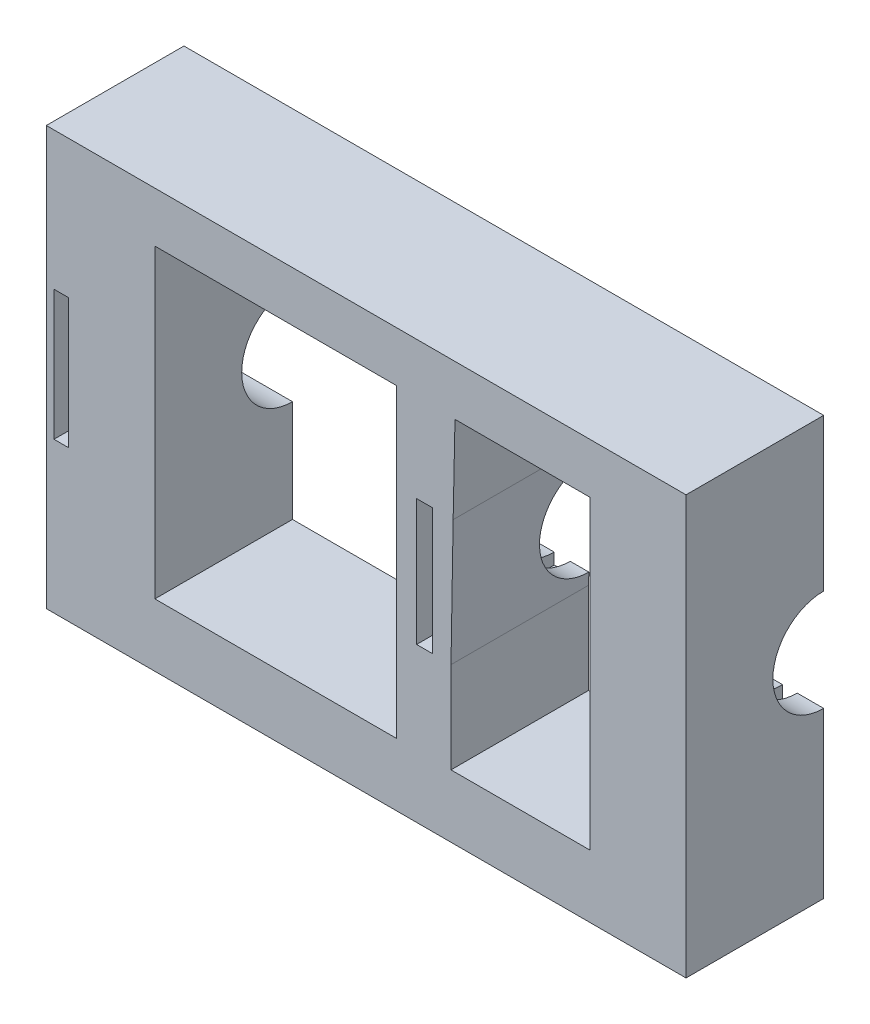
ISO-10303-21;
HEADER;
FILE_DESCRIPTION(('STEP AP214'),'2;1');
FILE_NAME('part.step','',(''),(''),'','','');
FILE_SCHEMA(('AUTOMOTIVE_DESIGN { 1 0 10303 214 1 1 1 1 }'));
ENDSEC;
DATA;
#1=APPLICATION_CONTEXT('core data for automotive mechanical design processes');
#2=APPLICATION_PROTOCOL_DEFINITION('international standard','automotive_design',2000,#1);
#3=PRODUCT_CONTEXT('',#1,'mechanical');
#4=PRODUCT('Part','Part','',(#3));
#5=PRODUCT_RELATED_PRODUCT_CATEGORY('part','',(#4));
#6=PRODUCT_DEFINITION_FORMATION('','',#4);
#7=PRODUCT_DEFINITION_CONTEXT('part definition',#1,'design');
#8=PRODUCT_DEFINITION('design','',#6,#7);
#9=PRODUCT_DEFINITION_SHAPE('','',#8);
#10=(LENGTH_UNIT() NAMED_UNIT(*) SI_UNIT(.MILLI.,.METRE.));
#11=(NAMED_UNIT(*) PLANE_ANGLE_UNIT() SI_UNIT($,.RADIAN.));
#12=(NAMED_UNIT(*) SI_UNIT($,.STERADIAN.) SOLID_ANGLE_UNIT());
#13=UNCERTAINTY_MEASURE_WITH_UNIT(LENGTH_MEASURE(1.E-05),#10,'distance_accuracy_value','');
#14=(GEOMETRIC_REPRESENTATION_CONTEXT(3) GLOBAL_UNCERTAINTY_ASSIGNED_CONTEXT((#13)) GLOBAL_UNIT_ASSIGNED_CONTEXT((#10,
#11,#12)) REPRESENTATION_CONTEXT('',''));
#15=CARTESIAN_POINT('',(0.,0.,0.));
#16=DIRECTION('',(0.,0.,1.));
#17=DIRECTION('',(1.,0.,0.));
#18=AXIS2_PLACEMENT_3D('',#15,#16,#17);
#19=CARTESIAN_POINT('',(0.,22.0472,0.));
#20=DIRECTION('',(0.,1.,0.));
#21=DIRECTION('',(0.,0.,1.));
#22=AXIS2_PLACEMENT_3D('',#19,#20,#21);
#23=PLANE('',#22);
#24=DIRECTION('',(1.,0.,0.));
#25=VECTOR('',#24,1.);
#26=CARTESIAN_POINT('',(0.,22.0472,-3.17171216904465));
#27=LINE('',#26,#25);
#28=CARTESIAN_POINT('',(10.9894216317088,22.0472,-3.17171216904465));
#29=VERTEX_POINT('',#28);
#30=CARTESIAN_POINT('',(35.4588719569476,22.0472,-3.17171216904465));
#31=VERTEX_POINT('',#30);
#32=EDGE_CURVE('E45',#29,#31,#27,.T.);
#33=ORIENTED_EDGE('',*,*,#32,.F.);
#34=DIRECTION('',(0.,0.,-1.));
#35=VECTOR('',#34,1.);
#36=CARTESIAN_POINT('',(10.9894216317088,22.0472,0.));
#37=LINE('',#36,#35);
#38=CARTESIAN_POINT('',(10.9894216317088,22.0472,-17.1069));
#39=VERTEX_POINT('',#38);
#40=EDGE_CURVE('E389',#29,#39,#37,.T.);
#41=ORIENTED_EDGE('',*,*,#40,.T.);
#42=DIRECTION('',(-1.,0.,0.));
#43=VECTOR('',#42,1.);
#44=CARTESIAN_POINT('',(66.04,22.0472,-17.1069));
#45=LINE('',#44,#43);
#46=CARTESIAN_POINT('',(35.4588719569476,22.0472,-17.1069));
#47=VERTEX_POINT('',#46);
#48=EDGE_CURVE('E357',#47,#39,#45,.T.);
#49=ORIENTED_EDGE('',*,*,#48,.F.);
#50=DIRECTION('',(0.,0.,-1.));
#51=VECTOR('',#50,1.);
#52=CARTESIAN_POINT('',(35.4588719569476,22.0472,1.9431));
#53=LINE('',#52,#51);
#54=EDGE_CURVE('E306',#31,#47,#53,.T.);
#55=ORIENTED_EDGE('',*,*,#54,.F.);
#56=EDGE_LOOP('',(#33,#41,#49,#55));
#57=FACE_BOUND('',#56,.T.);
#58=ADVANCED_FACE('F35',(#57),#23,.F.);
#59=CARTESIAN_POINT('',(0.,-8.89,0.));
#60=DIRECTION('',(0.,-1.,0.));
#61=DIRECTION('',(0.,0.,-1.));
#62=AXIS2_PLACEMENT_3D('',#59,#60,#61);
#63=PLANE('',#62);
#64=DIRECTION('',(-1.,0.,0.));
#65=VECTOR('',#64,1.);
#66=CARTESIAN_POINT('',(0.,-8.89,-3.17171216904465));
#67=LINE('',#66,#65);
#68=CARTESIAN_POINT('',(35.4588719569476,-8.89,-3.17171216904465));
#69=VERTEX_POINT('',#68);
#70=CARTESIAN_POINT('',(10.9894216317088,-8.89,-3.17171216904465));
#71=VERTEX_POINT('',#70);
#72=EDGE_CURVE('E11',#69,#71,#67,.T.);
#73=ORIENTED_EDGE('',*,*,#72,.F.);
#74=DIRECTION('',(0.,0.,-1.));
#75=VECTOR('',#74,1.);
#76=CARTESIAN_POINT('',(35.4588719569476,-8.89,0.));
#77=LINE('',#76,#75);
#78=CARTESIAN_POINT('',(35.4588719569476,-8.89,-17.1069));
#79=VERTEX_POINT('',#78);
#80=EDGE_CURVE('E321',#69,#79,#77,.T.);
#81=ORIENTED_EDGE('',*,*,#80,.T.);
#82=DIRECTION('',(1.,0.,0.));
#83=VECTOR('',#82,1.);
#84=CARTESIAN_POINT('',(66.04,-8.89,-17.1069));
#85=LINE('',#84,#83);
#86=CARTESIAN_POINT('',(10.9894216317088,-8.89,-17.1069));
#87=VERTEX_POINT('',#86);
#88=EDGE_CURVE('E417',#87,#79,#85,.T.);
#89=ORIENTED_EDGE('',*,*,#88,.F.);
#90=DIRECTION('',(0.,0.,1.));
#91=VECTOR('',#90,1.);
#92=CARTESIAN_POINT('',(10.9894216317088,-8.89,0.));
#93=LINE('',#92,#91);
#94=EDGE_CURVE('E353',#87,#71,#93,.T.);
#95=ORIENTED_EDGE('',*,*,#94,.T.);
#96=EDGE_LOOP('',(#73,#81,#89,#95));
#97=FACE_BOUND('',#96,.T.);
#98=ADVANCED_FACE('F696',(#97),#63,.F.);
#99=CARTESIAN_POINT('',(55.0505783682912,13.1572,-3.21005743926288));
#100=DIRECTION('',(1.,0.,0.));
#101=DIRECTION('',(0.,0.,-1.));
#102=AXIS2_PLACEMENT_3D('',#99,#100,#101);
#103=PLANE('',#102);
#104=DIRECTION('',(0.,-1.,0.));
#105=VECTOR('',#104,1.);
#106=CARTESIAN_POINT('',(55.0505783682912,13.1572,-3.17171216904465));
#107=LINE('',#106,#105);
#108=CARTESIAN_POINT('',(55.0505783682912,22.0472,-3.17171216904465));
#109=VERTEX_POINT('',#108);
#110=CARTESIAN_POINT('',(55.0505783682912,-8.89,-3.17171216904465));
#111=VERTEX_POINT('',#110);
#112=EDGE_CURVE('E292',#109,#111,#107,.T.);
#113=ORIENTED_EDGE('',*,*,#112,.F.);
#114=DIRECTION('',(0.,0.,1.));
#115=VECTOR('',#114,1.);
#116=CARTESIAN_POINT('',(55.0505783682912,22.0472,-17.1069));
#117=LINE('',#116,#115);
#118=CARTESIAN_POINT('',(55.0505783682912,22.0472,-17.1069));
#119=VERTEX_POINT('',#118);
#120=EDGE_CURVE('E384',#119,#109,#117,.T.);
#121=ORIENTED_EDGE('',*,*,#120,.F.);
#122=DIRECTION('',(0.,-1.,0.));
#123=VECTOR('',#122,1.);
#124=CARTESIAN_POINT('',(55.0505783682912,13.1572,-17.1069));
#125=LINE('',#124,#123);
#126=CARTESIAN_POINT('',(55.0505783682912,11.7221,-17.1069));
#127=VERTEX_POINT('',#126);
#128=EDGE_CURVE('E349',#119,#127,#125,.T.);
#129=ORIENTED_EDGE('',*,*,#128,.T.);
#130=CARTESIAN_POINT('',(55.0505783682912,6.5786,-17.1069));
#131=DIRECTION('',(1.,0.,0.));
#132=DIRECTION('',(0.,0.,-1.));
#133=AXIS2_PLACEMENT_3D('',#130,#131,#132);
#134=CIRCLE('',#133,5.1435);
#135=CARTESIAN_POINT('',(55.0505783682912,1.4351,-17.1069));
#136=VERTEX_POINT('',#135);
#137=EDGE_CURVE('E352',#127,#136,#134,.T.);
#138=ORIENTED_EDGE('',*,*,#137,.T.);
#139=CARTESIAN_POINT('',(55.0505783682912,-8.89,-17.1069));
#140=VERTEX_POINT('',#139);
#141=EDGE_CURVE('E354',#136,#140,#125,.T.);
#142=ORIENTED_EDGE('',*,*,#141,.T.);
#143=DIRECTION('',(0.,0.,-1.));
#144=VECTOR('',#143,1.);
#145=CARTESIAN_POINT('',(55.0505783682912,-8.89,-17.1069));
#146=LINE('',#145,#144);
#147=EDGE_CURVE('E312',#111,#140,#146,.T.);
#148=ORIENTED_EDGE('',*,*,#147,.F.);
#149=EDGE_LOOP('',(#113,#121,#129,#138,#142,#148));
#150=FACE_BOUND('',#149,.T.);
#151=ADVANCED_FACE('F607',(#150),#103,.F.);
#152=CARTESIAN_POINT('',(10.9894216317088,13.1572,-17.1069));
#153=DIRECTION('',(-1.,0.,0.));
#154=DIRECTION('',(0.,0.,1.));
#155=AXIS2_PLACEMENT_3D('',#152,#153,#154);
#156=PLANE('',#155);
#157=DIRECTION('',(0.,1.,0.));
#158=VECTOR('',#157,1.);
#159=CARTESIAN_POINT('',(10.9894216317088,13.1572,-3.17171216904465));
#160=LINE('',#159,#158);
#161=EDGE_CURVE('E518',#71,#29,#160,.T.);
#162=ORIENTED_EDGE('',*,*,#161,.F.);
#163=ORIENTED_EDGE('',*,*,#94,.F.);
#164=DIRECTION('',(0.,-1.,0.));
#165=VECTOR('',#164,1.);
#166=CARTESIAN_POINT('',(10.9894216317088,13.1572,-17.1069));
#167=LINE('',#166,#165);
#168=CARTESIAN_POINT('',(10.9894216317088,1.4351,-17.1069));
#169=VERTEX_POINT('',#168);
#170=EDGE_CURVE('E358',#169,#87,#167,.T.);
#171=ORIENTED_EDGE('',*,*,#170,.F.);
#172=CARTESIAN_POINT('',(10.9894216317088,6.5786,-17.1069));
#173=DIRECTION('',(-1.,0.,0.));
#174=DIRECTION('',(0.,0.,1.));
#175=AXIS2_PLACEMENT_3D('',#172,#173,#174);
#176=CIRCLE('',#175,5.1435);
#177=CARTESIAN_POINT('',(10.9894216317088,11.7221,-17.1069));
#178=VERTEX_POINT('',#177);
#179=EDGE_CURVE('E361',#169,#178,#176,.T.);
#180=ORIENTED_EDGE('',*,*,#179,.T.);
#181=EDGE_CURVE('E332',#39,#178,#167,.T.);
#182=ORIENTED_EDGE('',*,*,#181,.F.);
#183=ORIENTED_EDGE('',*,*,#40,.F.);
#184=EDGE_LOOP('',(#162,#163,#171,#180,#182,#183));
#185=FACE_BOUND('',#184,.T.);
#186=ADVANCED_FACE('F655',(#185),#156,.F.);
#187=CARTESIAN_POINT('',(0.,13.1572,-17.1069));
#188=DIRECTION('',(1.,0.,0.));
#189=DIRECTION('',(0.,0.,-1.));
#190=AXIS2_PLACEMENT_3D('',#187,#188,#189);
#191=PLANE('',#190);
#192=DIRECTION('',(0.,-1.,0.));
#193=VECTOR('',#192,1.);
#194=CARTESIAN_POINT('',(0.,27.1272,-3.17171216904465));
#195=LINE('',#194,#193);
#196=CARTESIAN_POINT('',(0.,27.1272,-3.17171216904465));
#197=VERTEX_POINT('',#196);
#198=CARTESIAN_POINT('',(0.,-15.24,-3.17171216904465));
#199=VERTEX_POINT('',#198);
#200=EDGE_CURVE('E39',#197,#199,#195,.T.);
#201=ORIENTED_EDGE('',*,*,#200,.F.);
#202=DIRECTION('',(0.,0.,1.));
#203=VECTOR('',#202,1.);
#204=CARTESIAN_POINT('',(0.,27.1272,-17.1069));
#205=LINE('',#204,#203);
#206=CARTESIAN_POINT('',(0.,27.1272,-17.1069));
#207=VERTEX_POINT('',#206);
#208=EDGE_CURVE('E387',#207,#197,#205,.T.);
#209=ORIENTED_EDGE('',*,*,#208,.F.);
#210=DIRECTION('',(0.,-1.,0.));
#211=VECTOR('',#210,1.);
#212=CARTESIAN_POINT('',(0.,13.1572,-17.1069));
#213=LINE('',#212,#211);
#214=CARTESIAN_POINT('',(0.,11.7221,-17.1069));
#215=VERTEX_POINT('',#214);
#216=EDGE_CURVE('E327',#207,#215,#213,.T.);
#217=ORIENTED_EDGE('',*,*,#216,.T.);
#218=CARTESIAN_POINT('',(0.,6.5786,-17.1069));
#219=DIRECTION('',(1.,0.,0.));
#220=DIRECTION('',(0.,0.,-1.));
#221=AXIS2_PLACEMENT_3D('',#218,#219,#220);
#222=CIRCLE('',#221,5.1435);
#223=CARTESIAN_POINT('',(0.,1.4351,-17.1069));
#224=VERTEX_POINT('',#223);
#225=EDGE_CURVE('E323',#215,#224,#222,.T.);
#226=ORIENTED_EDGE('',*,*,#225,.T.);
#227=CARTESIAN_POINT('',(0.,-15.24,-17.1069));
#228=VERTEX_POINT('',#227);
#229=EDGE_CURVE('E326',#224,#228,#213,.T.);
#230=ORIENTED_EDGE('',*,*,#229,.T.);
#231=DIRECTION('',(0.,0.,-1.));
#232=VECTOR('',#231,1.);
#233=CARTESIAN_POINT('',(0.,-15.24,3.17828783095535));
#234=LINE('',#233,#232);
#235=EDGE_CURVE('E505',#199,#228,#234,.T.);
#236=ORIENTED_EDGE('',*,*,#235,.F.);
#237=EDGE_LOOP('',(#201,#209,#217,#226,#230,#236));
#238=FACE_BOUND('',#237,.T.);
#239=ADVANCED_FACE('F545',(#238),#191,.F.);
#240=DIRECTION('',(1.,0.,0.));
#241=VECTOR('',#240,1.);
#242=CARTESIAN_POINT('',(0.,22.0472,-3.17171216904465));
#243=LINE('',#242,#241);
#244=CARTESIAN_POINT('',(41.3758963344435,22.0472,-3.17171216904465));
#245=VERTEX_POINT('',#244);
#246=EDGE_CURVE('E477',#245,#109,#243,.T.);
#247=ORIENTED_EDGE('',*,*,#246,.F.);
#248=DIRECTION('',(0.,0.,-1.));
#249=VECTOR('',#248,1.);
#250=CARTESIAN_POINT('',(41.3758963344435,22.0472,0.));
#251=LINE('',#250,#249);
#252=CARTESIAN_POINT('',(41.3758963344435,22.0472,-17.1069));
#253=VERTEX_POINT('',#252);
#254=EDGE_CURVE('E388',#245,#253,#251,.T.);
#255=ORIENTED_EDGE('',*,*,#254,.T.);
#256=EDGE_CURVE('E391',#119,#253,#45,.T.);
#257=ORIENTED_EDGE('',*,*,#256,.F.);
#258=ORIENTED_EDGE('',*,*,#120,.T.);
#259=EDGE_LOOP('',(#247,#255,#257,#258));
#260=FACE_BOUND('',#259,.T.);
#261=ADVANCED_FACE('F610',(#260),#23,.F.);
#262=CARTESIAN_POINT('',(0.,27.1272,0.));
#263=DIRECTION('',(0.,1.,0.));
#264=DIRECTION('',(0.,0.,1.));
#265=AXIS2_PLACEMENT_3D('',#262,#263,#264);
#266=PLANE('',#265);
#267=ORIENTED_EDGE('',*,*,#208,.T.);
#268=DIRECTION('',(-1.,0.,0.));
#269=VECTOR('',#268,1.);
#270=CARTESIAN_POINT('',(0.,27.1272,-3.17171216904465));
#271=LINE('',#270,#269);
#272=CARTESIAN_POINT('',(64.77,27.1272,-3.17171216904465));
#273=VERTEX_POINT('',#272);
#274=EDGE_CURVE('E532',#273,#197,#271,.T.);
#275=ORIENTED_EDGE('',*,*,#274,.F.);
#276=DIRECTION('',(0.,0.,1.));
#277=VECTOR('',#276,1.);
#278=CARTESIAN_POINT('',(64.77,27.1272,-17.1069));
#279=LINE('',#278,#277);
#280=CARTESIAN_POINT('',(64.77,27.1272,-17.1069));
#281=VERTEX_POINT('',#280);
#282=EDGE_CURVE('E483',#281,#273,#279,.T.);
#283=ORIENTED_EDGE('',*,*,#282,.F.);
#284=DIRECTION('',(-1.,0.,0.));
#285=VECTOR('',#284,1.);
#286=CARTESIAN_POINT('',(66.04,27.1272,-17.1069));
#287=LINE('',#286,#285);
#288=EDGE_CURVE('E317',#281,#207,#287,.T.);
#289=ORIENTED_EDGE('',*,*,#288,.T.);
#290=EDGE_LOOP('',(#267,#275,#283,#289));
#291=FACE_BOUND('',#290,.T.);
#292=ADVANCED_FACE('F547',(#291),#266,.T.);
#293=DIRECTION('',(-1.,0.,0.));
#294=VECTOR('',#293,1.);
#295=CARTESIAN_POINT('',(0.,-8.89,-3.17171216904465));
#296=LINE('',#295,#294);
#297=CARTESIAN_POINT('',(40.9712498169064,-8.89,-3.17171216904465));
#298=VERTEX_POINT('',#297);
#299=EDGE_CURVE('E287',#111,#298,#296,.T.);
#300=ORIENTED_EDGE('',*,*,#299,.F.);
#301=ORIENTED_EDGE('',*,*,#147,.T.);
#302=CARTESIAN_POINT('',(40.9712498169064,-8.89,-17.1069));
#303=VERTEX_POINT('',#302);
#304=EDGE_CURVE('E310',#303,#140,#85,.T.);
#305=ORIENTED_EDGE('',*,*,#304,.F.);
#306=DIRECTION('',(0.,0.,1.));
#307=VECTOR('',#306,1.);
#308=CARTESIAN_POINT('',(40.9712498169064,-8.89,0.));
#309=LINE('',#308,#307);
#310=EDGE_CURVE('E302',#303,#298,#309,.T.);
#311=ORIENTED_EDGE('',*,*,#310,.T.);
#312=EDGE_LOOP('',(#300,#301,#305,#311));
#313=FACE_BOUND('',#312,.T.);
#314=ADVANCED_FACE('F308',(#313),#63,.F.);
#315=CARTESIAN_POINT('',(0.,0.365369571658807,1.9431));
#316=DIRECTION('',(0.,1.,0.));
#317=DIRECTION('',(0.,0.,1.));
#318=AXIS2_PLACEMENT_3D('',#315,#316,#317);
#319=PLANE('',#318);
#320=DIRECTION('',(0.,0.,-1.));
#321=VECTOR('',#320,1.);
#322=CARTESIAN_POINT('',(37.4908719569476,0.365369571658807,1.9431));
#323=LINE('',#322,#321);
#324=CARTESIAN_POINT('',(37.4908719569476,0.365369571658807,-3.17171216904465));
#325=VERTEX_POINT('',#324);
#326=CARTESIAN_POINT('',(37.4908719569476,0.365369571658807,-17.1069));
#327=VERTEX_POINT('',#326);
#328=EDGE_CURVE('E421',#325,#327,#323,.T.);
#329=ORIENTED_EDGE('',*,*,#328,.F.);
#330=DIRECTION('',(1.,0.,0.));
#331=VECTOR('',#330,1.);
#332=CARTESIAN_POINT('',(0.,0.365369571658807,-3.17171216904465));
#333=LINE('',#332,#331);
#334=CARTESIAN_POINT('',(39.106263289872,0.365369571658807,-3.17171216904465));
#335=VERTEX_POINT('',#334);
#336=EDGE_CURVE('E311',#325,#335,#333,.T.);
#337=ORIENTED_EDGE('',*,*,#336,.T.);
#338=DIRECTION('',(0.,0.,-1.));
#339=VECTOR('',#338,1.);
#340=CARTESIAN_POINT('',(39.106263289872,0.365369571658807,1.9431));
#341=LINE('',#340,#339);
#342=CARTESIAN_POINT('',(39.106263289872,0.365369571658807,-17.1069));
#343=VERTEX_POINT('',#342);
#344=EDGE_CURVE('E315',#335,#343,#341,.T.);
#345=ORIENTED_EDGE('',*,*,#344,.T.);
#346=DIRECTION('',(1.,0.,0.));
#347=VECTOR('',#346,1.);
#348=CARTESIAN_POINT('',(0.,0.365369571658807,-17.1069));
#349=LINE('',#348,#347);
#350=EDGE_CURVE('E458',#327,#343,#349,.T.);
#351=ORIENTED_EDGE('',*,*,#350,.F.);
#352=EDGE_LOOP('',(#329,#337,#345,#351));
#353=FACE_BOUND('',#352,.T.);
#354=ADVANCED_FACE('F751',(#353),#319,.T.);
#355=CARTESIAN_POINT('',(40.9537664668092,-0.695619484047465,1.9431));
#356=DIRECTION('',(0.999855777897971,-0.0169830328281757,0.));
#357=DIRECTION('',(0.0169830328281757,0.999855777897971,0.));
#358=AXIS2_PLACEMENT_3D('',#355,#356,#357);
#359=PLANE('',#358);
#360=DIRECTION('',(0.,0.,-1.));
#361=VECTOR('',#360,1.);
#362=CARTESIAN_POINT('',(41.189063289872,13.1572,1.9431));
#363=LINE('',#362,#361);
#364=CARTESIAN_POINT('',(41.189063289872,13.1572,-3.17171216904465));
#365=VERTEX_POINT('',#364);
#366=CARTESIAN_POINT('',(41.189063289872,13.1572,-17.1069));
#367=VERTEX_POINT('',#366);
#368=EDGE_CURVE('E431',#365,#367,#363,.T.);
#369=ORIENTED_EDGE('',*,*,#368,.F.);
#370=DIRECTION('',(-0.0169830328281757,-0.999855777897971,0.));
#371=VECTOR('',#370,1.);
#372=CARTESIAN_POINT('',(40.9537664668092,-0.695619484047465,-3.17171216904465));
#373=LINE('',#372,#371);
#374=CARTESIAN_POINT('',(40.9712498169064,0.333691875622167,-3.17171216904465));
#375=VERTEX_POINT('',#374);
#376=EDGE_CURVE('E425',#365,#375,#373,.T.);
#377=ORIENTED_EDGE('',*,*,#376,.T.);
#378=DIRECTION('',(0.,0.,-1.));
#379=VECTOR('',#378,1.);
#380=CARTESIAN_POINT('',(40.9712498169064,0.333691875622167,1.9431));
#381=LINE('',#380,#379);
#382=CARTESIAN_POINT('',(40.9712498169064,0.333691875622167,-17.1069));
#383=VERTEX_POINT('',#382);
#384=EDGE_CURVE('E304',#375,#383,#381,.T.);
#385=ORIENTED_EDGE('',*,*,#384,.T.);
#386=DIRECTION('',(-0.0169830328281757,-0.999855777897971,0.));
#387=VECTOR('',#386,1.);
#388=CARTESIAN_POINT('',(40.9537664668092,-0.695619484047465,-17.1069));
#389=LINE('',#388,#387);
#390=CARTESIAN_POINT('',(40.9910363434789,1.4986,-17.1069));
#391=VERTEX_POINT('',#390);
#392=EDGE_CURVE('E442',#391,#383,#389,.T.);
#393=ORIENTED_EDGE('',*,*,#392,.F.);
#394=CARTESIAN_POINT('',(41.0773225946306,6.5786,-17.1069));
#395=DIRECTION('',(0.999855777897971,-0.0169830328281757,0.));
#396=DIRECTION('',(-0.0169830328281757,-0.999855777897971,0.));
#397=AXIS2_PLACEMENT_3D('',#394,#395,#396);
#398=ELLIPSE('',#397,5.08073275395762,5.08);
#399=CARTESIAN_POINT('',(41.1636088457822,11.6586,-17.1069));
#400=VERTEX_POINT('',#399);
#401=EDGE_CURVE('E469',#400,#391,#398,.T.);
#402=ORIENTED_EDGE('',*,*,#401,.F.);
#403=EDGE_CURVE('E443',#367,#400,#389,.T.);
#404=ORIENTED_EDGE('',*,*,#403,.F.);
#405=EDGE_LOOP('',(#369,#377,#385,#393,#402,#404));
#406=FACE_BOUND('',#405,.T.);
#407=ADVANCED_FACE('F617',(#406),#359,.T.);
#408=CARTESIAN_POINT('',(37.4908719569476,0.,1.9431));
#409=DIRECTION('',(1.,0.,0.));
#410=DIRECTION('',(0.,0.,-1.));
#411=AXIS2_PLACEMENT_3D('',#408,#409,#410);
#412=PLANE('',#411);
#413=DIRECTION('',(0.,0.,-1.));
#414=VECTOR('',#413,1.);
#415=CARTESIAN_POINT('',(37.4908719569476,13.1572,1.9431));
#416=LINE('',#415,#414);
#417=CARTESIAN_POINT('',(37.4908719569476,13.1572,-3.17171216904465));
#418=VERTEX_POINT('',#417);
#419=CARTESIAN_POINT('',(37.4908719569476,13.1572,-17.1069));
#420=VERTEX_POINT('',#419);
#421=EDGE_CURVE('E428',#418,#420,#416,.T.);
#422=ORIENTED_EDGE('',*,*,#421,.F.);
#423=DIRECTION('',(0.,-1.,0.));
#424=VECTOR('',#423,1.);
#425=CARTESIAN_POINT('',(37.4908719569476,0.,-3.17171216904465));
#426=LINE('',#425,#424);
#427=EDGE_CURVE('E281',#418,#325,#426,.T.);
#428=ORIENTED_EDGE('',*,*,#427,.T.);
#429=ORIENTED_EDGE('',*,*,#328,.T.);
#430=DIRECTION('',(0.,-1.,0.));
#431=VECTOR('',#430,1.);
#432=CARTESIAN_POINT('',(37.4908719569476,0.,-17.1069));
#433=LINE('',#432,#431);
#434=CARTESIAN_POINT('',(37.4908719569476,1.4986,-17.1069));
#435=VERTEX_POINT('',#434);
#436=EDGE_CURVE('E461',#435,#327,#433,.T.);
#437=ORIENTED_EDGE('',*,*,#436,.F.);
#438=CARTESIAN_POINT('',(37.4908719569476,6.5786,-17.1069));
#439=DIRECTION('',(1.,0.,0.));
#440=DIRECTION('',(0.,0.,-1.));
#441=AXIS2_PLACEMENT_3D('',#438,#439,#440);
#442=CIRCLE('',#441,5.08);
#443=CARTESIAN_POINT('',(37.4908719569476,11.6586,-17.1069));
#444=VERTEX_POINT('',#443);
#445=EDGE_CURVE('E465',#444,#435,#442,.T.);
#446=ORIENTED_EDGE('',*,*,#445,.F.);
#447=EDGE_CURVE('E452',#420,#444,#433,.T.);
#448=ORIENTED_EDGE('',*,*,#447,.F.);
#449=EDGE_LOOP('',(#422,#428,#429,#437,#446,#448));
#450=FACE_BOUND('',#449,.T.);
#451=ADVANCED_FACE('F639',(#450),#412,.T.);
#452=CARTESIAN_POINT('',(39.106263289872,0.,1.9431));
#453=DIRECTION('',(-1.,0.,0.));
#454=DIRECTION('',(0.,0.,1.));
#455=AXIS2_PLACEMENT_3D('',#452,#453,#454);
#456=PLANE('',#455);
#457=ORIENTED_EDGE('',*,*,#344,.F.);
#458=DIRECTION('',(0.,1.,0.));
#459=VECTOR('',#458,1.);
#460=CARTESIAN_POINT('',(39.106263289872,0.,-3.17171216904465));
#461=LINE('',#460,#459);
#462=CARTESIAN_POINT('',(39.106263289872,13.1572,-3.17171216904465));
#463=VERTEX_POINT('',#462);
#464=EDGE_CURVE('E423',#335,#463,#461,.T.);
#465=ORIENTED_EDGE('',*,*,#464,.T.);
#466=DIRECTION('',(0.,0.,-1.));
#467=VECTOR('',#466,1.);
#468=CARTESIAN_POINT('',(39.106263289872,13.1572,1.9431));
#469=LINE('',#468,#467);
#470=CARTESIAN_POINT('',(39.106263289872,13.1572,-17.1069));
#471=VERTEX_POINT('',#470);
#472=EDGE_CURVE('E426',#463,#471,#469,.T.);
#473=ORIENTED_EDGE('',*,*,#472,.T.);
#474=DIRECTION('',(0.,1.,0.));
#475=VECTOR('',#474,1.);
#476=CARTESIAN_POINT('',(39.106263289872,0.,-17.1069));
#477=LINE('',#476,#475);
#478=CARTESIAN_POINT('',(39.106263289872,11.6586,-17.1069));
#479=VERTEX_POINT('',#478);
#480=EDGE_CURVE('E453',#479,#471,#477,.T.);
#481=ORIENTED_EDGE('',*,*,#480,.F.);
#482=CARTESIAN_POINT('',(39.106263289872,6.5786,-17.1069));
#483=DIRECTION('',(-1.,0.,0.));
#484=DIRECTION('',(0.,0.,1.));
#485=AXIS2_PLACEMENT_3D('',#482,#483,#484);
#486=CIRCLE('',#485,5.08);
#487=CARTESIAN_POINT('',(39.106263289872,1.4986,-17.1069));
#488=VERTEX_POINT('',#487);
#489=EDGE_CURVE('E471',#488,#479,#486,.T.);
#490=ORIENTED_EDGE('',*,*,#489,.F.);
#491=EDGE_CURVE('E454',#343,#488,#477,.T.);
#492=ORIENTED_EDGE('',*,*,#491,.F.);
#493=EDGE_LOOP('',(#457,#465,#473,#481,#490,#492));
#494=FACE_BOUND('',#493,.T.);
#495=ADVANCED_FACE('F628',(#494),#456,.T.);
#496=CARTESIAN_POINT('',(0.,13.1572,1.9431));
#497=DIRECTION('',(0.,-1.,0.));
#498=DIRECTION('',(0.,0.,-1.));
#499=AXIS2_PLACEMENT_3D('',#496,#497,#498);
#500=PLANE('',#499);
#501=ORIENTED_EDGE('',*,*,#472,.F.);
#502=DIRECTION('',(-1.,0.,0.));
#503=VECTOR('',#502,1.);
#504=CARTESIAN_POINT('',(0.,13.1572,-3.17171216904465));
#505=LINE('',#504,#503);
#506=EDGE_CURVE('E277',#463,#418,#505,.T.);
#507=ORIENTED_EDGE('',*,*,#506,.T.);
#508=ORIENTED_EDGE('',*,*,#421,.T.);
#509=DIRECTION('',(-1.,0.,0.));
#510=VECTOR('',#509,1.);
#511=CARTESIAN_POINT('',(0.,13.1572,-17.1069));
#512=LINE('',#511,#510);
#513=EDGE_CURVE('E449',#471,#420,#512,.T.);
#514=ORIENTED_EDGE('',*,*,#513,.F.);
#515=EDGE_LOOP('',(#501,#507,#508,#514));
#516=FACE_BOUND('',#515,.T.);
#517=ADVANCED_FACE('F634',(#516),#500,.T.);
#518=CARTESIAN_POINT('',(40.8944882674512,-0.859442266501925,1.9431));
#519=DIRECTION('',(0.999779235097224,-0.0210114508878062,0.));
#520=DIRECTION('',(0.0210114508878062,0.999779235097224,0.));
#521=AXIS2_PLACEMENT_3D('',#518,#519,#520);
#522=PLANE('',#521);
#523=ORIENTED_EDGE('',*,*,#254,.F.);
#524=DIRECTION('',(-0.0210114508878062,-0.999779235097224,0.));
#525=VECTOR('',#524,1.);
#526=CARTESIAN_POINT('',(40.8944882674512,-0.859442266501925,-3.17171216904465));
#527=LINE('',#526,#525);
#528=EDGE_CURVE('E430',#245,#365,#527,.T.);
#529=ORIENTED_EDGE('',*,*,#528,.T.);
#530=ORIENTED_EDGE('',*,*,#368,.T.);
#531=DIRECTION('',(-0.0210114508878062,-0.999779235097224,0.));
#532=VECTOR('',#531,1.);
#533=CARTESIAN_POINT('',(40.8944882674512,-0.859442266501925,-17.1069));
#534=LINE('',#533,#532);
#535=EDGE_CURVE('E394',#253,#367,#534,.T.);
#536=ORIENTED_EDGE('',*,*,#535,.F.);
#537=EDGE_LOOP('',(#523,#529,#530,#536));
#538=FACE_BOUND('',#537,.T.);
#539=ADVANCED_FACE('F613',(#538),#522,.T.);
#540=CARTESIAN_POINT('',(35.4588719569476,0.,1.9431));
#541=DIRECTION('',(-1.,0.,0.));
#542=DIRECTION('',(0.,0.,1.));
#543=AXIS2_PLACEMENT_3D('',#540,#541,#542);
#544=PLANE('',#543);
#545=ORIENTED_EDGE('',*,*,#80,.F.);
#546=DIRECTION('',(0.,1.,0.));
#547=VECTOR('',#546,1.);
#548=CARTESIAN_POINT('',(35.4588719569476,0.,-3.17171216904465));
#549=LINE('',#548,#547);
#550=EDGE_CURVE('E433',#69,#31,#549,.T.);
#551=ORIENTED_EDGE('',*,*,#550,.T.);
#552=ORIENTED_EDGE('',*,*,#54,.T.);
#553=DIRECTION('',(0.,1.,0.));
#554=VECTOR('',#553,1.);
#555=CARTESIAN_POINT('',(35.4588719569476,0.,-17.1069));
#556=LINE('',#555,#554);
#557=CARTESIAN_POINT('',(35.4588719569476,11.6586,-17.1069));
#558=VERTEX_POINT('',#557);
#559=EDGE_CURVE('E439',#558,#47,#556,.T.);
#560=ORIENTED_EDGE('',*,*,#559,.F.);
#561=CARTESIAN_POINT('',(35.4588719569476,6.5786,-17.1069));
#562=DIRECTION('',(-1.,0.,0.));
#563=DIRECTION('',(0.,0.,1.));
#564=AXIS2_PLACEMENT_3D('',#561,#562,#563);
#565=CIRCLE('',#564,5.08);
#566=CARTESIAN_POINT('',(35.4588719569476,1.4986,-17.1069));
#567=VERTEX_POINT('',#566);
#568=EDGE_CURVE('E467',#567,#558,#565,.T.);
#569=ORIENTED_EDGE('',*,*,#568,.F.);
#570=EDGE_CURVE('E420',#79,#567,#556,.T.);
#571=ORIENTED_EDGE('',*,*,#570,.F.);
#572=EDGE_LOOP('',(#545,#551,#552,#560,#569,#571));
#573=FACE_BOUND('',#572,.T.);
#574=ADVANCED_FACE('F649',(#573),#544,.T.);
#575=CARTESIAN_POINT('',(40.9712498169064,0.,1.9431));
#576=DIRECTION('',(1.,0.,0.));
#577=DIRECTION('',(0.,0.,-1.));
#578=AXIS2_PLACEMENT_3D('',#575,#576,#577);
#579=PLANE('',#578);
#580=ORIENTED_EDGE('',*,*,#384,.F.);
#581=DIRECTION('',(0.,-1.,0.));
#582=VECTOR('',#581,1.);
#583=CARTESIAN_POINT('',(40.9712498169064,0.,-3.17171216904465));
#584=LINE('',#583,#582);
#585=EDGE_CURVE('E289',#375,#298,#584,.T.);
#586=ORIENTED_EDGE('',*,*,#585,.T.);
#587=ORIENTED_EDGE('',*,*,#310,.F.);
#588=DIRECTION('',(0.,-1.,0.));
#589=VECTOR('',#588,1.);
#590=CARTESIAN_POINT('',(40.9712498169064,0.,-17.1069));
#591=LINE('',#590,#589);
#592=EDGE_CURVE('E440',#383,#303,#591,.T.);
#593=ORIENTED_EDGE('',*,*,#592,.F.);
#594=EDGE_LOOP('',(#580,#586,#587,#593));
#595=FACE_BOUND('',#594,.T.);
#596=ADVANCED_FACE('F300',(#595),#579,.T.);
#597=CARTESIAN_POINT('',(64.77,0.,0.));
#598=DIRECTION('',(-1.,0.,0.));
#599=DIRECTION('',(0.,0.,1.));
#600=AXIS2_PLACEMENT_3D('',#597,#598,#599);
#601=PLANE('',#600);
#602=DIRECTION('',(0.,1.,0.));
#603=VECTOR('',#602,1.);
#604=CARTESIAN_POINT('',(64.77,27.1272,-3.17171216904465));
#605=LINE('',#604,#603);
#606=CARTESIAN_POINT('',(64.77,-15.24,-3.17171216904465));
#607=VERTEX_POINT('',#606);
#608=EDGE_CURVE('E95',#607,#273,#605,.T.);
#609=ORIENTED_EDGE('',*,*,#608,.F.);
#610=DIRECTION('',(0.,0.,1.));
#611=VECTOR('',#610,1.);
#612=CARTESIAN_POINT('',(64.77,-15.24,3.17828783095535));
#613=LINE('',#612,#611);
#614=CARTESIAN_POINT('',(64.77,-15.24,-17.1069));
#615=VERTEX_POINT('',#614);
#616=EDGE_CURVE('E510',#615,#607,#613,.T.);
#617=ORIENTED_EDGE('',*,*,#616,.F.);
#618=DIRECTION('',(0.,1.,0.));
#619=VECTOR('',#618,1.);
#620=CARTESIAN_POINT('',(64.77,-34.29,-17.1069));
#621=LINE('',#620,#619);
#622=CARTESIAN_POINT('',(64.77,1.4351,-17.1069));
#623=VERTEX_POINT('',#622);
#624=EDGE_CURVE('E305',#615,#623,#621,.T.);
#625=ORIENTED_EDGE('',*,*,#624,.T.);
#626=CARTESIAN_POINT('',(64.77,6.5786,-17.1069));
#627=DIRECTION('',(-1.,0.,0.));
#628=DIRECTION('',(0.,0.,1.));
#629=AXIS2_PLACEMENT_3D('',#626,#627,#628);
#630=CIRCLE('',#629,5.1435);
#631=CARTESIAN_POINT('',(64.77,11.7221,-17.1069));
#632=VERTEX_POINT('',#631);
#633=EDGE_CURVE('E478',#632,#623,#630,.F.);
#634=ORIENTED_EDGE('',*,*,#633,.F.);
#635=EDGE_CURVE('E482',#632,#281,#621,.T.);
#636=ORIENTED_EDGE('',*,*,#635,.T.);
#637=ORIENTED_EDGE('',*,*,#282,.T.);
#638=EDGE_LOOP('',(#609,#617,#625,#634,#636,#637));
#639=FACE_BOUND('',#638,.T.);
#640=ADVANCED_FACE('F679',(#639),#601,.F.);
#641=CARTESIAN_POINT('',(2.24803947558665,0.,-1.8669));
#642=DIRECTION('',(1.,0.,0.));
#643=DIRECTION('',(0.,0.,-1.));
#644=AXIS2_PLACEMENT_3D('',#641,#642,#643);
#645=PLANE('',#644);
#646=DIRECTION('',(0.,-1.,0.));
#647=VECTOR('',#646,1.);
#648=CARTESIAN_POINT('',(2.24803947558665,0.,-3.17171216904465));
#649=LINE('',#648,#647);
#650=CARTESIAN_POINT('',(2.24803947558665,13.1572,-3.17171216904465));
#651=VERTEX_POINT('',#650);
#652=CARTESIAN_POINT('',(2.24803947558665,0.,-3.17171216904465));
#653=VERTEX_POINT('',#652);
#654=EDGE_CURVE('E531',#651,#653,#649,.T.);
#655=ORIENTED_EDGE('',*,*,#654,.F.);
#656=DIRECTION('',(0.,0.,-1.));
#657=VECTOR('',#656,1.);
#658=CARTESIAN_POINT('',(2.24803947558665,13.1572,-1.8669));
#659=LINE('',#658,#657);
#660=CARTESIAN_POINT('',(2.24803947558665,13.1572,-17.1069));
#661=VERTEX_POINT('',#660);
#662=EDGE_CURVE('E486',#651,#661,#659,.T.);
#663=ORIENTED_EDGE('',*,*,#662,.T.);
#664=DIRECTION('',(0.,-1.,0.));
#665=VECTOR('',#664,1.);
#666=CARTESIAN_POINT('',(2.24803947558665,0.,-17.1069));
#667=LINE('',#666,#665);
#668=CARTESIAN_POINT('',(2.24803947558665,11.7221,-17.1069));
#669=VERTEX_POINT('',#668);
#670=EDGE_CURVE('E499',#661,#669,#667,.T.);
#671=ORIENTED_EDGE('',*,*,#670,.T.);
#672=CARTESIAN_POINT('',(2.24803947558665,6.5786,-17.1069));
#673=DIRECTION('',(1.,0.,0.));
#674=DIRECTION('',(0.,0.,-1.));
#675=AXIS2_PLACEMENT_3D('',#672,#673,#674);
#676=CIRCLE('',#675,5.1435);
#677=CARTESIAN_POINT('',(2.24803947558665,1.4351,-17.1069));
#678=VERTEX_POINT('',#677);
#679=EDGE_CURVE('E468',#678,#669,#676,.F.);
#680=ORIENTED_EDGE('',*,*,#679,.F.);
#681=CARTESIAN_POINT('',(2.24803947558665,0.,-17.1069));
#682=VERTEX_POINT('',#681);
#683=EDGE_CURVE('E494',#678,#682,#667,.T.);
#684=ORIENTED_EDGE('',*,*,#683,.T.);
#685=DIRECTION('',(0.,0.,-1.));
#686=VECTOR('',#685,1.);
#687=CARTESIAN_POINT('',(2.24803947558665,0.,-1.8669));
#688=LINE('',#687,#686);
#689=EDGE_CURVE('E487',#653,#682,#688,.T.);
#690=ORIENTED_EDGE('',*,*,#689,.F.);
#691=EDGE_LOOP('',(#655,#663,#671,#680,#684,#690));
#692=FACE_BOUND('',#691,.T.);
#693=ADVANCED_FACE('F582',(#692),#645,.F.);
#694=CARTESIAN_POINT('',(0.774839475586652,13.1572,-1.8669));
#695=DIRECTION('',(-1.,0.,0.));
#696=DIRECTION('',(0.,0.,1.));
#697=AXIS2_PLACEMENT_3D('',#694,#695,#696);
#698=PLANE('',#697);
#699=DIRECTION('',(0.,1.,0.));
#700=VECTOR('',#699,1.);
#701=CARTESIAN_POINT('',(0.774839475586652,13.1572,-3.17171216904465));
#702=LINE('',#701,#700);
#703=CARTESIAN_POINT('',(0.774839475586652,0.,-3.17171216904465));
#704=VERTEX_POINT('',#703);
#705=CARTESIAN_POINT('',(0.774839475586652,13.1572,-3.17171216904465));
#706=VERTEX_POINT('',#705);
#707=EDGE_CURVE('E520',#704,#706,#702,.T.);
#708=ORIENTED_EDGE('',*,*,#707,.F.);
#709=DIRECTION('',(0.,0.,-1.));
#710=VECTOR('',#709,1.);
#711=CARTESIAN_POINT('',(0.774839475586652,0.,-1.8669));
#712=LINE('',#711,#710);
#713=CARTESIAN_POINT('',(0.774839475586652,0.,-17.1069));
#714=VERTEX_POINT('',#713);
#715=EDGE_CURVE('E491',#704,#714,#712,.T.);
#716=ORIENTED_EDGE('',*,*,#715,.T.);
#717=DIRECTION('',(0.,1.,0.));
#718=VECTOR('',#717,1.);
#719=CARTESIAN_POINT('',(0.774839475586652,13.1572,-17.1069));
#720=LINE('',#719,#718);
#721=CARTESIAN_POINT('',(0.774839475586653,1.4351,-17.1069));
#722=VERTEX_POINT('',#721);
#723=EDGE_CURVE('E493',#714,#722,#720,.T.);
#724=ORIENTED_EDGE('',*,*,#723,.T.);
#725=CARTESIAN_POINT('',(0.774839475586653,6.5786,-17.1069));
#726=DIRECTION('',(-1.,0.,0.));
#727=DIRECTION('',(0.,0.,1.));
#728=AXIS2_PLACEMENT_3D('',#725,#726,#727);
#729=CIRCLE('',#728,5.1435);
#730=CARTESIAN_POINT('',(0.774839475586652,11.7221,-17.1069));
#731=VERTEX_POINT('',#730);
#732=EDGE_CURVE('E373',#731,#722,#729,.F.);
#733=ORIENTED_EDGE('',*,*,#732,.F.);
#734=CARTESIAN_POINT('',(0.774839475586652,13.1572,-17.1069));
#735=VERTEX_POINT('',#734);
#736=EDGE_CURVE('E497',#731,#735,#720,.T.);
#737=ORIENTED_EDGE('',*,*,#736,.T.);
#738=DIRECTION('',(0.,0.,-1.));
#739=VECTOR('',#738,1.);
#740=CARTESIAN_POINT('',(0.774839475586652,13.1572,-1.8669));
#741=LINE('',#740,#739);
#742=EDGE_CURVE('E495',#706,#735,#741,.T.);
#743=ORIENTED_EDGE('',*,*,#742,.F.);
#744=EDGE_LOOP('',(#708,#716,#724,#733,#737,#743));
#745=FACE_BOUND('',#744,.T.);
#746=ADVANCED_FACE('F599',(#745),#698,.F.);
#747=CARTESIAN_POINT('',(2.24803947558665,13.1572,-1.8669));
#748=DIRECTION('',(0.,1.,0.));
#749=DIRECTION('',(0.,0.,1.));
#750=AXIS2_PLACEMENT_3D('',#747,#748,#749);
#751=PLANE('',#750);
#752=DIRECTION('',(1.,0.,0.));
#753=VECTOR('',#752,1.);
#754=CARTESIAN_POINT('',(2.24803947558665,13.1572,-3.17171216904465));
#755=LINE('',#754,#753);
#756=EDGE_CURVE('E529',#706,#651,#755,.T.);
#757=ORIENTED_EDGE('',*,*,#756,.F.);
#758=ORIENTED_EDGE('',*,*,#742,.T.);
#759=DIRECTION('',(1.,0.,0.));
#760=VECTOR('',#759,1.);
#761=CARTESIAN_POINT('',(2.24803947558665,13.1572,-17.1069));
#762=LINE('',#761,#760);
#763=EDGE_CURVE('E490',#735,#661,#762,.T.);
#764=ORIENTED_EDGE('',*,*,#763,.T.);
#765=ORIENTED_EDGE('',*,*,#662,.F.);
#766=EDGE_LOOP('',(#757,#758,#764,#765));
#767=FACE_BOUND('',#766,.T.);
#768=ADVANCED_FACE('F596',(#767),#751,.F.);
#769=CARTESIAN_POINT('',(0.774839475586652,0.,-1.8669));
#770=DIRECTION('',(0.,-1.,0.));
#771=DIRECTION('',(1.,0.,0.));
#772=AXIS2_PLACEMENT_3D('',#769,#770,#771);
#773=PLANE('',#772);
#774=DIRECTION('',(-1.,0.,0.));
#775=VECTOR('',#774,1.);
#776=CARTESIAN_POINT('',(0.774839475586652,0.,-3.17171216904465));
#777=LINE('',#776,#775);
#778=EDGE_CURVE('E535',#653,#704,#777,.T.);
#779=ORIENTED_EDGE('',*,*,#778,.F.);
#780=ORIENTED_EDGE('',*,*,#689,.T.);
#781=DIRECTION('',(-1.,0.,0.));
#782=VECTOR('',#781,1.);
#783=CARTESIAN_POINT('',(0.774839475586652,0.,-17.1069));
#784=LINE('',#783,#782);
#785=EDGE_CURVE('E489',#682,#714,#784,.T.);
#786=ORIENTED_EDGE('',*,*,#785,.T.);
#787=ORIENTED_EDGE('',*,*,#715,.F.);
#788=EDGE_LOOP('',(#779,#780,#786,#787));
#789=FACE_BOUND('',#788,.T.);
#790=ADVANCED_FACE('F590',(#789),#773,.F.);
#791=CARTESIAN_POINT('',(0.,-15.24,0.));
#792=DIRECTION('',(0.,1.,0.));
#793=DIRECTION('',(0.,0.,1.));
#794=AXIS2_PLACEMENT_3D('',#791,#792,#793);
#795=PLANE('',#794);
#796=DIRECTION('',(1.,0.,0.));
#797=VECTOR('',#796,1.);
#798=CARTESIAN_POINT('',(0.,-15.24,-3.17171216904465));
#799=LINE('',#798,#797);
#800=EDGE_CURVE('E99',#199,#607,#799,.T.);
#801=ORIENTED_EDGE('',*,*,#800,.F.);
#802=ORIENTED_EDGE('',*,*,#235,.T.);
#803=DIRECTION('',(1.,0.,0.));
#804=VECTOR('',#803,1.);
#805=CARTESIAN_POINT('',(64.77,-15.24,-17.1069));
#806=LINE('',#805,#804);
#807=EDGE_CURVE('E508',#228,#615,#806,.T.);
#808=ORIENTED_EDGE('',*,*,#807,.T.);
#809=ORIENTED_EDGE('',*,*,#616,.T.);
#810=EDGE_LOOP('',(#801,#802,#808,#809));
#811=FACE_BOUND('',#810,.T.);
#812=ADVANCED_FACE('F724',(#811),#795,.F.);
#813=CARTESIAN_POINT('',(3.94983947558665,13.1572,-17.1069));
#814=DIRECTION('',(0.,0.,1.));
#815=DIRECTION('',(1.,0.,0.));
#816=AXIS2_PLACEMENT_3D('',#813,#814,#815);
#817=PLANE('',#816);
#818=DIRECTION('',(-1.,0.,0.));
#819=VECTOR('',#818,1.);
#820=CARTESIAN_POINT('',(66.04,11.7221,-17.1069));
#821=LINE('',#820,#819);
#822=EDGE_CURVE('E513',#178,#669,#821,.T.);
#823=ORIENTED_EDGE('',*,*,#822,.T.);
#824=ORIENTED_EDGE('',*,*,#670,.F.);
#825=ORIENTED_EDGE('',*,*,#763,.F.);
#826=ORIENTED_EDGE('',*,*,#736,.F.);
#827=EDGE_CURVE('E411',#731,#215,#821,.T.);
#828=ORIENTED_EDGE('',*,*,#827,.T.);
#829=ORIENTED_EDGE('',*,*,#216,.F.);
#830=ORIENTED_EDGE('',*,*,#288,.F.);
#831=ORIENTED_EDGE('',*,*,#635,.F.);
#832=CARTESIAN_POINT('',(62.0901605244133,11.7221,-17.1069));
#833=VERTEX_POINT('',#832);
#834=EDGE_CURVE('E383',#632,#833,#821,.T.);
#835=ORIENTED_EDGE('',*,*,#834,.T.);
#836=DIRECTION('',(0.,-1.,0.));
#837=VECTOR('',#836,1.);
#838=CARTESIAN_POINT('',(62.0901605244133,13.1572,-17.1069));
#839=LINE('',#838,#837);
#840=CARTESIAN_POINT('',(62.0901605244133,13.1572,-17.1069));
#841=VERTEX_POINT('',#840);
#842=EDGE_CURVE('E328',#841,#833,#839,.T.);
#843=ORIENTED_EDGE('',*,*,#842,.F.);
#844=DIRECTION('',(-1.,0.,0.));
#845=VECTOR('',#844,1.);
#846=CARTESIAN_POINT('',(66.04,13.1572,-17.1069));
#847=LINE('',#846,#845);
#848=CARTESIAN_POINT('',(60.6169605244134,13.1572,-17.1069));
#849=VERTEX_POINT('',#848);
#850=EDGE_CURVE('E347',#841,#849,#847,.T.);
#851=ORIENTED_EDGE('',*,*,#850,.T.);
#852=DIRECTION('',(0.,-1.,0.));
#853=VECTOR('',#852,1.);
#854=CARTESIAN_POINT('',(60.6169605244134,13.1572,-17.1069));
#855=LINE('',#854,#853);
#856=CARTESIAN_POINT('',(60.6169605244134,11.7221,-17.1069));
#857=VERTEX_POINT('',#856);
#858=EDGE_CURVE('E343',#849,#857,#855,.T.);
#859=ORIENTED_EDGE('',*,*,#858,.T.);
#860=EDGE_CURVE('E346',#857,#127,#821,.T.);
#861=ORIENTED_EDGE('',*,*,#860,.T.);
#862=ORIENTED_EDGE('',*,*,#128,.F.);
#863=ORIENTED_EDGE('',*,*,#256,.T.);
#864=ORIENTED_EDGE('',*,*,#535,.T.);
#865=ORIENTED_EDGE('',*,*,#403,.T.);
#866=DIRECTION('',(-1.,0.,0.));
#867=VECTOR('',#866,1.);
#868=CARTESIAN_POINT('',(50.6988719569476,11.6586,-17.1069));
#869=LINE('',#868,#867);
#870=EDGE_CURVE('E446',#400,#479,#869,.T.);
#871=ORIENTED_EDGE('',*,*,#870,.T.);
#872=ORIENTED_EDGE('',*,*,#480,.T.);
#873=ORIENTED_EDGE('',*,*,#513,.T.);
#874=ORIENTED_EDGE('',*,*,#447,.T.);
#875=EDGE_CURVE('E464',#444,#558,#869,.T.);
#876=ORIENTED_EDGE('',*,*,#875,.T.);
#877=ORIENTED_EDGE('',*,*,#559,.T.);
#878=ORIENTED_EDGE('',*,*,#48,.T.);
#879=ORIENTED_EDGE('',*,*,#181,.T.);
#880=EDGE_LOOP('',(#823,#824,#825,#826,#828,#829,#830,#831,#835,#843,#851,#859,#861,#862,#863,
#864,#865,#871,#872,#873,#874,#876,#877,#878,#879));
#881=FACE_BOUND('',#880,.T.);
#882=ADVANCED_FACE('F552',(#881),#817,.F.);
#883=CARTESIAN_POINT('',(62.0901605244133,13.1572,-3.21005743926288));
#884=DIRECTION('',(1.,0.,0.));
#885=DIRECTION('',(0.,0.,-1.));
#886=AXIS2_PLACEMENT_3D('',#883,#884,#885);
#887=PLANE('',#886);
#888=ORIENTED_EDGE('',*,*,#842,.T.);
#889=CARTESIAN_POINT('',(62.0901605244133,6.5786,-17.1069));
#890=DIRECTION('',(1.,0.,0.));
#891=DIRECTION('',(0.,0.,-1.));
#892=AXIS2_PLACEMENT_3D('',#889,#890,#891);
#893=CIRCLE('',#892,5.1435);
#894=CARTESIAN_POINT('',(62.0901605244133,1.4351,-17.1069));
#895=VERTEX_POINT('',#894);
#896=EDGE_CURVE('E331',#833,#895,#893,.T.);
#897=ORIENTED_EDGE('',*,*,#896,.T.);
#898=CARTESIAN_POINT('',(62.0901605244133,0.,-17.1069));
#899=VERTEX_POINT('',#898);
#900=EDGE_CURVE('E333',#895,#899,#839,.T.);
#901=ORIENTED_EDGE('',*,*,#900,.T.);
#902=DIRECTION('',(0.,0.,1.));
#903=VECTOR('',#902,1.);
#904=CARTESIAN_POINT('',(62.0901605244133,0.,-3.21005743926288));
#905=LINE('',#904,#903);
#906=CARTESIAN_POINT('',(62.0901605244133,0.,-3.21005743926288));
#907=VERTEX_POINT('',#906);
#908=EDGE_CURVE('E367',#899,#907,#905,.T.);
#909=ORIENTED_EDGE('',*,*,#908,.T.);
#910=DIRECTION('',(0.,-1.,0.));
#911=VECTOR('',#910,1.);
#912=CARTESIAN_POINT('',(62.0901605244133,13.1572,-3.21005743926288));
#913=LINE('',#912,#911);
#914=CARTESIAN_POINT('',(62.0901605244133,13.1572,-3.21005743926288));
#915=VERTEX_POINT('',#914);
#916=EDGE_CURVE('E334',#915,#907,#913,.T.);
#917=ORIENTED_EDGE('',*,*,#916,.F.);
#918=DIRECTION('',(0.,0.,1.));
#919=VECTOR('',#918,1.);
#920=CARTESIAN_POINT('',(62.0901605244133,13.1572,-3.21005743926288));
#921=LINE('',#920,#919);
#922=EDGE_CURVE('E377',#841,#915,#921,.T.);
#923=ORIENTED_EDGE('',*,*,#922,.F.);
#924=EDGE_LOOP('',(#888,#897,#901,#909,#917,#923));
#925=FACE_BOUND('',#924,.T.);
#926=ADVANCED_FACE('F672',(#925),#887,.F.);
#927=CARTESIAN_POINT('',(62.0901605244133,13.1572,-3.21005743926288));
#928=DIRECTION('',(0.,0.,1.));
#929=DIRECTION('',(1.,0.,0.));
#930=AXIS2_PLACEMENT_3D('',#927,#928,#929);
#931=PLANE('',#930);
#932=DIRECTION('',(-1.,0.,0.));
#933=VECTOR('',#932,1.);
#934=CARTESIAN_POINT('',(62.0901605244133,0.,-3.21005743926288));
#935=LINE('',#934,#933);
#936=CARTESIAN_POINT('',(60.6169605244134,0.,-3.21005743926288));
#937=VERTEX_POINT('',#936);
#938=EDGE_CURVE('E338',#907,#937,#935,.T.);
#939=ORIENTED_EDGE('',*,*,#938,.T.);
#940=DIRECTION('',(0.,-1.,0.));
#941=VECTOR('',#940,1.);
#942=CARTESIAN_POINT('',(60.6169605244134,13.1572,-3.21005743926288));
#943=LINE('',#942,#941);
#944=CARTESIAN_POINT('',(60.6169605244134,13.1572,-3.21005743926288));
#945=VERTEX_POINT('',#944);
#946=EDGE_CURVE('E339',#945,#937,#943,.T.);
#947=ORIENTED_EDGE('',*,*,#946,.F.);
#948=DIRECTION('',(-1.,0.,0.));
#949=VECTOR('',#948,1.);
#950=CARTESIAN_POINT('',(62.0901605244133,13.1572,-3.21005743926288));
#951=LINE('',#950,#949);
#952=EDGE_CURVE('E374',#915,#945,#951,.T.);
#953=ORIENTED_EDGE('',*,*,#952,.F.);
#954=ORIENTED_EDGE('',*,*,#916,.T.);
#955=EDGE_LOOP('',(#939,#947,#953,#954));
#956=FACE_BOUND('',#955,.T.);
#957=ADVANCED_FACE('F670',(#956),#931,.F.);
#958=CARTESIAN_POINT('',(60.6169605244134,13.1572,-3.21005743926288));
#959=DIRECTION('',(-1.,0.,0.));
#960=DIRECTION('',(0.,0.,1.));
#961=AXIS2_PLACEMENT_3D('',#958,#959,#960);
#962=PLANE('',#961);
#963=CARTESIAN_POINT('',(60.6169605244134,1.4351,-17.1069));
#964=VERTEX_POINT('',#963);
#965=CARTESIAN_POINT('',(60.6169605244134,0.,-17.1069));
#966=VERTEX_POINT('',#965);
#967=EDGE_CURVE('E348',#964,#966,#855,.T.);
#968=ORIENTED_EDGE('',*,*,#967,.F.);
#969=CARTESIAN_POINT('',(60.6169605244134,6.5786,-17.1069));
#970=DIRECTION('',(-1.,0.,0.));
#971=DIRECTION('',(0.,0.,1.));
#972=AXIS2_PLACEMENT_3D('',#969,#970,#971);
#973=CIRCLE('',#972,5.1435);
#974=EDGE_CURVE('E337',#964,#857,#973,.T.);
#975=ORIENTED_EDGE('',*,*,#974,.T.);
#976=ORIENTED_EDGE('',*,*,#858,.F.);
#977=DIRECTION('',(0.,0.,-1.));
#978=VECTOR('',#977,1.);
#979=CARTESIAN_POINT('',(60.6169605244134,13.1572,-3.21005743926288));
#980=LINE('',#979,#978);
#981=EDGE_CURVE('E370',#945,#849,#980,.T.);
#982=ORIENTED_EDGE('',*,*,#981,.F.);
#983=ORIENTED_EDGE('',*,*,#946,.T.);
#984=DIRECTION('',(0.,0.,-1.));
#985=VECTOR('',#984,1.);
#986=CARTESIAN_POINT('',(60.6169605244134,0.,-3.21005743926288));
#987=LINE('',#986,#985);
#988=EDGE_CURVE('E342',#937,#966,#987,.T.);
#989=ORIENTED_EDGE('',*,*,#988,.T.);
#990=EDGE_LOOP('',(#968,#975,#976,#982,#983,#989));
#991=FACE_BOUND('',#990,.T.);
#992=ADVANCED_FACE('F666',(#991),#962,.F.);
#993=ORIENTED_EDGE('',*,*,#683,.F.);
#994=DIRECTION('',(-1.,0.,0.));
#995=VECTOR('',#994,1.);
#996=CARTESIAN_POINT('',(66.04,1.4351,-17.1069));
#997=LINE('',#996,#995);
#998=EDGE_CURVE('E364',#678,#169,#997,.F.);
#999=ORIENTED_EDGE('',*,*,#998,.T.);
#1000=ORIENTED_EDGE('',*,*,#170,.T.);
#1001=ORIENTED_EDGE('',*,*,#88,.T.);
#1002=ORIENTED_EDGE('',*,*,#570,.T.);
#1003=DIRECTION('',(-1.,0.,0.));
#1004=VECTOR('',#1003,1.);
#1005=CARTESIAN_POINT('',(50.6988719569476,1.4986,-17.1069));
#1006=LINE('',#1005,#1004);
#1007=EDGE_CURVE('E438',#567,#435,#1006,.F.);
#1008=ORIENTED_EDGE('',*,*,#1007,.T.);
#1009=ORIENTED_EDGE('',*,*,#436,.T.);
#1010=ORIENTED_EDGE('',*,*,#350,.T.);
#1011=ORIENTED_EDGE('',*,*,#491,.T.);
#1012=EDGE_CURVE('E457',#488,#391,#1006,.F.);
#1013=ORIENTED_EDGE('',*,*,#1012,.T.);
#1014=ORIENTED_EDGE('',*,*,#392,.T.);
#1015=ORIENTED_EDGE('',*,*,#592,.T.);
#1016=ORIENTED_EDGE('',*,*,#304,.T.);
#1017=ORIENTED_EDGE('',*,*,#141,.F.);
#1018=EDGE_CURVE('E416',#136,#964,#997,.F.);
#1019=ORIENTED_EDGE('',*,*,#1018,.T.);
#1020=ORIENTED_EDGE('',*,*,#967,.T.);
#1021=DIRECTION('',(1.,0.,0.));
#1022=VECTOR('',#1021,1.);
#1023=CARTESIAN_POINT('',(66.04,0.,-17.1069));
#1024=LINE('',#1023,#1022);
#1025=EDGE_CURVE('E398',#966,#899,#1024,.T.);
#1026=ORIENTED_EDGE('',*,*,#1025,.T.);
#1027=ORIENTED_EDGE('',*,*,#900,.F.);
#1028=EDGE_CURVE('E400',#895,#623,#997,.F.);
#1029=ORIENTED_EDGE('',*,*,#1028,.T.);
#1030=ORIENTED_EDGE('',*,*,#624,.F.);
#1031=ORIENTED_EDGE('',*,*,#807,.F.);
#1032=ORIENTED_EDGE('',*,*,#229,.F.);
#1033=EDGE_CURVE('E380',#224,#722,#997,.F.);
#1034=ORIENTED_EDGE('',*,*,#1033,.T.);
#1035=ORIENTED_EDGE('',*,*,#723,.F.);
#1036=ORIENTED_EDGE('',*,*,#785,.F.);
#1037=EDGE_LOOP('',(#993,#999,#1000,#1001,#1002,#1008,#1009,#1010,#1011,#1013,#1014,#1015,#1016,
#1017,#1019,#1020,#1026,#1027,#1029,#1030,#1031,#1032,#1034,#1035,#1036));
#1038=FACE_BOUND('',#1037,.T.);
#1039=ADVANCED_FACE('F562',(#1038),#817,.F.);
#1040=CARTESIAN_POINT('',(0.,13.1572,0.));
#1041=DIRECTION('',(0.,1.,0.));
#1042=DIRECTION('',(0.,0.,1.));
#1043=AXIS2_PLACEMENT_3D('',#1040,#1041,#1042);
#1044=PLANE('',#1043);
#1045=ORIENTED_EDGE('',*,*,#850,.F.);
#1046=ORIENTED_EDGE('',*,*,#922,.T.);
#1047=ORIENTED_EDGE('',*,*,#952,.T.);
#1048=ORIENTED_EDGE('',*,*,#981,.T.);
#1049=EDGE_LOOP('',(#1045,#1046,#1047,#1048));
#1050=FACE_BOUND('',#1049,.T.);
#1051=ADVANCED_FACE('F683',(#1050),#1044,.F.);
#1052=CARTESIAN_POINT('',(0.,0.,0.));
#1053=DIRECTION('',(0.,1.,0.));
#1054=DIRECTION('',(0.,0.,1.));
#1055=AXIS2_PLACEMENT_3D('',#1052,#1053,#1054);
#1056=PLANE('',#1055);
#1057=ORIENTED_EDGE('',*,*,#988,.F.);
#1058=ORIENTED_EDGE('',*,*,#938,.F.);
#1059=ORIENTED_EDGE('',*,*,#908,.F.);
#1060=ORIENTED_EDGE('',*,*,#1025,.F.);
#1061=EDGE_LOOP('',(#1057,#1058,#1059,#1060));
#1062=FACE_BOUND('',#1061,.T.);
#1063=ADVANCED_FACE('F665',(#1062),#1056,.T.);
#1064=CARTESIAN_POINT('',(66.04,6.5786,-17.1069));
#1065=DIRECTION('',(-1.,0.,0.));
#1066=DIRECTION('',(0.,0.,1.));
#1067=AXIS2_PLACEMENT_3D('',#1064,#1065,#1066);
#1068=CYLINDRICAL_SURFACE('',#1067,5.1435);
#1069=ORIENTED_EDGE('',*,*,#827,.F.);
#1070=ORIENTED_EDGE('',*,*,#732,.T.);
#1071=ORIENTED_EDGE('',*,*,#1033,.F.);
#1072=ORIENTED_EDGE('',*,*,#225,.F.);
#1073=EDGE_LOOP('',(#1069,#1070,#1071,#1072));
#1074=FACE_BOUND('',#1073,.T.);
#1075=ADVANCED_FACE('F690',(#1074),#1068,.F.);
#1076=ORIENTED_EDGE('',*,*,#834,.F.);
#1077=ORIENTED_EDGE('',*,*,#633,.T.);
#1078=ORIENTED_EDGE('',*,*,#1028,.F.);
#1079=ORIENTED_EDGE('',*,*,#896,.F.);
#1080=EDGE_LOOP('',(#1076,#1077,#1078,#1079));
#1081=FACE_BOUND('',#1080,.T.);
#1082=ADVANCED_FACE('F677',(#1081),#1068,.F.);
#1083=ORIENTED_EDGE('',*,*,#974,.F.);
#1084=ORIENTED_EDGE('',*,*,#1018,.F.);
#1085=ORIENTED_EDGE('',*,*,#137,.F.);
#1086=ORIENTED_EDGE('',*,*,#860,.F.);
#1087=EDGE_LOOP('',(#1083,#1084,#1085,#1086));
#1088=FACE_BOUND('',#1087,.T.);
#1089=ADVANCED_FACE('F767',(#1088),#1068,.F.);
#1090=ORIENTED_EDGE('',*,*,#179,.F.);
#1091=ORIENTED_EDGE('',*,*,#998,.F.);
#1092=ORIENTED_EDGE('',*,*,#679,.T.);
#1093=ORIENTED_EDGE('',*,*,#822,.F.);
#1094=EDGE_LOOP('',(#1090,#1091,#1092,#1093));
#1095=FACE_BOUND('',#1094,.T.);
#1096=ADVANCED_FACE('F577',(#1095),#1068,.F.);
#1097=CARTESIAN_POINT('',(50.6988719569476,6.5786,-17.1069));
#1098=DIRECTION('',(-1.,0.,0.));
#1099=DIRECTION('',(0.,0.,1.));
#1100=AXIS2_PLACEMENT_3D('',#1097,#1098,#1099);
#1101=CYLINDRICAL_SURFACE('',#1100,5.08);
#1102=ORIENTED_EDGE('',*,*,#445,.T.);
#1103=ORIENTED_EDGE('',*,*,#1007,.F.);
#1104=ORIENTED_EDGE('',*,*,#568,.T.);
#1105=ORIENTED_EDGE('',*,*,#875,.F.);
#1106=EDGE_LOOP('',(#1102,#1103,#1104,#1105));
#1107=FACE_BOUND('',#1106,.T.);
#1108=ADVANCED_FACE('F744',(#1107),#1101,.F.);
#1109=ORIENTED_EDGE('',*,*,#401,.T.);
#1110=ORIENTED_EDGE('',*,*,#1012,.F.);
#1111=ORIENTED_EDGE('',*,*,#489,.T.);
#1112=ORIENTED_EDGE('',*,*,#870,.F.);
#1113=EDGE_LOOP('',(#1109,#1110,#1111,#1112));
#1114=FACE_BOUND('',#1113,.T.);
#1115=ADVANCED_FACE('F621',(#1114),#1101,.F.);
#1116=CARTESIAN_POINT('',(0.,0.,-3.17171216904465));
#1117=DIRECTION('',(0.,0.,1.));
#1118=DIRECTION('',(1.,0.,0.));
#1119=AXIS2_PLACEMENT_3D('',#1116,#1117,#1118);
#1120=PLANE('',#1119);
#1121=ORIENTED_EDGE('',*,*,#427,.F.);
#1122=ORIENTED_EDGE('',*,*,#506,.F.);
#1123=ORIENTED_EDGE('',*,*,#464,.F.);
#1124=ORIENTED_EDGE('',*,*,#336,.F.);
#1125=EDGE_LOOP('',(#1121,#1122,#1123,#1124));
#1126=FACE_BOUND('',#1125,.T.);
#1127=ORIENTED_EDGE('',*,*,#246,.T.);
#1128=ORIENTED_EDGE('',*,*,#112,.T.);
#1129=ORIENTED_EDGE('',*,*,#299,.T.);
#1130=ORIENTED_EDGE('',*,*,#585,.F.);
#1131=ORIENTED_EDGE('',*,*,#376,.F.);
#1132=ORIENTED_EDGE('',*,*,#528,.F.);
#1133=EDGE_LOOP('',(#1127,#1128,#1129,#1130,#1131,#1132));
#1134=FACE_BOUND('',#1133,.T.);
#1135=ORIENTED_EDGE('',*,*,#200,.T.);
#1136=ORIENTED_EDGE('',*,*,#800,.T.);
#1137=ORIENTED_EDGE('',*,*,#608,.T.);
#1138=ORIENTED_EDGE('',*,*,#274,.T.);
#1139=EDGE_LOOP('',(#1135,#1136,#1137,#1138));
#1140=FACE_BOUND('',#1139,.T.);
#1141=ORIENTED_EDGE('',*,*,#756,.T.);
#1142=ORIENTED_EDGE('',*,*,#654,.T.);
#1143=ORIENTED_EDGE('',*,*,#778,.T.);
#1144=ORIENTED_EDGE('',*,*,#707,.T.);
#1145=EDGE_LOOP('',(#1141,#1142,#1143,#1144));
#1146=FACE_BOUND('',#1145,.T.);
#1147=ORIENTED_EDGE('',*,*,#161,.T.);
#1148=ORIENTED_EDGE('',*,*,#32,.T.);
#1149=ORIENTED_EDGE('',*,*,#550,.F.);
#1150=ORIENTED_EDGE('',*,*,#72,.T.);
#1151=EDGE_LOOP('',(#1147,#1148,#1149,#1150));
#1152=FACE_BOUND('',#1151,.T.);
#1153=ADVANCED_FACE('F37',(#1126,#1134,#1140,#1146,#1152),#1120,.T.);
#1154=CLOSED_SHELL('',(#58,#98,#151,#186,#239,#261,#292,#314,#354,#407,#451,#495,#517,#539,#574,
#596,#640,#693,#746,#768,#790,#812,#882,#926,#957,#992,#1039,#1051,#1063,#1075,#1082,#1089,
#1096,#1108,#1115,#1153));
#1155=MANIFOLD_SOLID_BREP('B2',#1154);
#1156=ADVANCED_BREP_SHAPE_REPRESENTATION('',(#18,#1155),#14);
#1157=SHAPE_DEFINITION_REPRESENTATION(#9,#1156);
ENDSEC;
END-ISO-10303-21;
